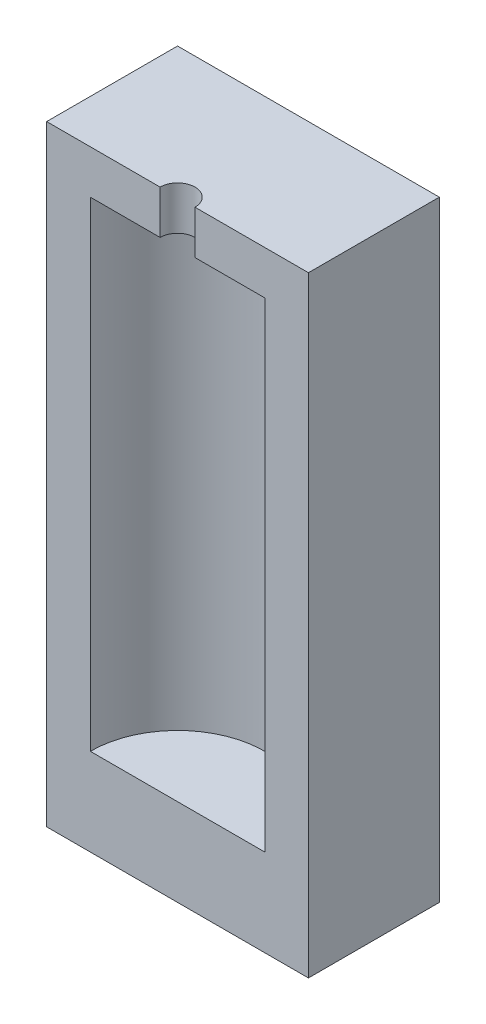
ISO-10303-21;
HEADER;
FILE_DESCRIPTION(('STEP AP214'),'2;1');
FILE_NAME('part.step','',(''),(''),'','','');
FILE_SCHEMA(('AUTOMOTIVE_DESIGN { 1 0 10303 214 1 1 1 1 }'));
ENDSEC;
DATA;
#1=APPLICATION_CONTEXT('core data for automotive mechanical design processes');
#2=APPLICATION_PROTOCOL_DEFINITION('international standard','automotive_design',2000,#1);
#3=PRODUCT_CONTEXT('',#1,'mechanical');
#4=PRODUCT('Part','Part','',(#3));
#5=PRODUCT_RELATED_PRODUCT_CATEGORY('part','',(#4));
#6=PRODUCT_DEFINITION_FORMATION('','',#4);
#7=PRODUCT_DEFINITION_CONTEXT('part definition',#1,'design');
#8=PRODUCT_DEFINITION('design','',#6,#7);
#9=PRODUCT_DEFINITION_SHAPE('','',#8);
#10=(LENGTH_UNIT() NAMED_UNIT(*) SI_UNIT(.MILLI.,.METRE.));
#11=(NAMED_UNIT(*) PLANE_ANGLE_UNIT() SI_UNIT($,.RADIAN.));
#12=(NAMED_UNIT(*) SI_UNIT($,.STERADIAN.) SOLID_ANGLE_UNIT());
#13=UNCERTAINTY_MEASURE_WITH_UNIT(LENGTH_MEASURE(1.E-05),#10,'distance_accuracy_value','');
#14=(GEOMETRIC_REPRESENTATION_CONTEXT(3) GLOBAL_UNCERTAINTY_ASSIGNED_CONTEXT((#13)) GLOBAL_UNIT_ASSIGNED_CONTEXT((#10,
#11,#12)) REPRESENTATION_CONTEXT('',''));
#15=CARTESIAN_POINT('',(0.,0.,0.));
#16=DIRECTION('',(0.,0.,1.));
#17=DIRECTION('',(1.,0.,0.));
#18=AXIS2_PLACEMENT_3D('',#15,#16,#17);
#19=CARTESIAN_POINT('',(-15.,70.,-7.5));
#20=DIRECTION('',(1.,0.,0.));
#21=DIRECTION('',(0.,0.,-1.));
#22=AXIS2_PLACEMENT_3D('',#19,#20,#21);
#23=PLANE('',#22);
#24=DIRECTION('',(0.,0.,1.));
#25=VECTOR('',#24,1.);
#26=CARTESIAN_POINT('',(-15.,0.,-7.5));
#27=LINE('',#26,#25);
#28=CARTESIAN_POINT('',(-15.,0.,-7.5));
#29=VERTEX_POINT('',#28);
#30=CARTESIAN_POINT('',(-15.,0.,7.5));
#31=VERTEX_POINT('',#30);
#32=EDGE_CURVE('E154',#29,#31,#27,.T.);
#33=ORIENTED_EDGE('',*,*,#32,.T.);
#34=DIRECTION('',(0.,-1.,0.));
#35=VECTOR('',#34,1.);
#36=CARTESIAN_POINT('',(-15.,70.,7.5));
#37=LINE('',#36,#35);
#38=CARTESIAN_POINT('',(-15.,70.,7.5));
#39=VERTEX_POINT('',#38);
#40=EDGE_CURVE('E126',#39,#31,#37,.T.);
#41=ORIENTED_EDGE('',*,*,#40,.F.);
#42=DIRECTION('',(0.,0.,1.));
#43=VECTOR('',#42,1.);
#44=CARTESIAN_POINT('',(-15.,70.,-7.5));
#45=LINE('',#44,#43);
#46=CARTESIAN_POINT('',(-15.,70.,-7.5));
#47=VERTEX_POINT('',#46);
#48=EDGE_CURVE('E155',#47,#39,#45,.T.);
#49=ORIENTED_EDGE('',*,*,#48,.F.);
#50=DIRECTION('',(0.,-1.,0.));
#51=VECTOR('',#50,1.);
#52=CARTESIAN_POINT('',(-15.,70.,-7.5));
#53=LINE('',#52,#51);
#54=EDGE_CURVE('E166',#47,#29,#53,.T.);
#55=ORIENTED_EDGE('',*,*,#54,.T.);
#56=EDGE_LOOP('',(#33,#41,#49,#55));
#57=FACE_BOUND('',#56,.T.);
#58=ADVANCED_FACE('F39',(#57),#23,.F.);
#59=CARTESIAN_POINT('',(-15.,70.,7.5));
#60=DIRECTION('',(0.,0.,-1.));
#61=DIRECTION('',(-1.,0.,0.));
#62=AXIS2_PLACEMENT_3D('',#59,#60,#61);
#63=PLANE('',#62);
#64=DIRECTION('',(0.,1.,0.));
#65=VECTOR('',#64,1.);
#66=CARTESIAN_POINT('',(-10.,10.,7.5));
#67=LINE('',#66,#65);
#68=CARTESIAN_POINT('',(-10.,10.,7.5));
#69=VERTEX_POINT('',#68);
#70=CARTESIAN_POINT('',(-10.,65.,7.5));
#71=VERTEX_POINT('',#70);
#72=EDGE_CURVE('E11',#69,#71,#67,.T.);
#73=ORIENTED_EDGE('',*,*,#72,.T.);
#74=DIRECTION('',(1.,0.,0.));
#75=VECTOR('',#74,1.);
#76=CARTESIAN_POINT('',(-15.,65.,7.5));
#77=LINE('',#76,#75);
#78=CARTESIAN_POINT('',(-2.,65.,7.5));
#79=VERTEX_POINT('',#78);
#80=EDGE_CURVE('E132',#71,#79,#77,.T.);
#81=ORIENTED_EDGE('',*,*,#80,.T.);
#82=DIRECTION('',(0.,1.,0.));
#83=VECTOR('',#82,1.);
#84=CARTESIAN_POINT('',(-2.,65.,7.5));
#85=LINE('',#84,#83);
#86=CARTESIAN_POINT('',(-2.,70.,7.5));
#87=VERTEX_POINT('',#86);
#88=EDGE_CURVE('E151',#79,#87,#85,.T.);
#89=ORIENTED_EDGE('',*,*,#88,.T.);
#90=DIRECTION('',(1.,0.,0.));
#91=VECTOR('',#90,1.);
#92=CARTESIAN_POINT('',(-15.,70.,7.5));
#93=LINE('',#92,#91);
#94=EDGE_CURVE('E92',#39,#87,#93,.T.);
#95=ORIENTED_EDGE('',*,*,#94,.F.);
#96=ORIENTED_EDGE('',*,*,#40,.T.);
#97=DIRECTION('',(1.,0.,0.));
#98=VECTOR('',#97,1.);
#99=CARTESIAN_POINT('',(-15.,0.,7.5));
#100=LINE('',#99,#98);
#101=CARTESIAN_POINT('',(15.,0.,7.5));
#102=VERTEX_POINT('',#101);
#103=EDGE_CURVE('E170',#31,#102,#100,.T.);
#104=ORIENTED_EDGE('',*,*,#103,.T.);
#105=DIRECTION('',(0.,-1.,0.));
#106=VECTOR('',#105,1.);
#107=CARTESIAN_POINT('',(15.,70.,7.5));
#108=LINE('',#107,#106);
#109=CARTESIAN_POINT('',(15.,70.,7.5));
#110=VERTEX_POINT('',#109);
#111=EDGE_CURVE('E183',#110,#102,#108,.T.);
#112=ORIENTED_EDGE('',*,*,#111,.F.);
#113=CARTESIAN_POINT('',(2.,70.,7.5));
#114=VERTEX_POINT('',#113);
#115=EDGE_CURVE('E158',#114,#110,#93,.T.);
#116=ORIENTED_EDGE('',*,*,#115,.F.);
#117=DIRECTION('',(0.,1.,0.));
#118=VECTOR('',#117,1.);
#119=CARTESIAN_POINT('',(2.,65.,7.5));
#120=LINE('',#119,#118);
#121=CARTESIAN_POINT('',(2.,65.,7.5));
#122=VERTEX_POINT('',#121);
#123=EDGE_CURVE('E54',#114,#122,#120,.F.);
#124=ORIENTED_EDGE('',*,*,#123,.T.);
#125=CARTESIAN_POINT('',(10.,65.,7.5));
#126=VERTEX_POINT('',#125);
#127=EDGE_CURVE('E130',#122,#126,#77,.T.);
#128=ORIENTED_EDGE('',*,*,#127,.T.);
#129=DIRECTION('',(0.,1.,0.));
#130=VECTOR('',#129,1.);
#131=CARTESIAN_POINT('',(10.,10.,7.5));
#132=LINE('',#131,#130);
#133=CARTESIAN_POINT('',(10.,10.,7.5));
#134=VERTEX_POINT('',#133);
#135=EDGE_CURVE('E117',#126,#134,#132,.F.);
#136=ORIENTED_EDGE('',*,*,#135,.T.);
#137=DIRECTION('',(1.,0.,0.));
#138=VECTOR('',#137,1.);
#139=CARTESIAN_POINT('',(-15.,10.,7.5));
#140=LINE('',#139,#138);
#141=EDGE_CURVE('E47',#69,#134,#140,.T.);
#142=ORIENTED_EDGE('',*,*,#141,.F.);
#143=EDGE_LOOP('',(#73,#81,#89,#95,#96,#104,#112,#116,#124,#128,#136,#142));
#144=FACE_BOUND('',#143,.T.);
#145=ADVANCED_FACE('F135',(#144),#63,.F.);
#146=CARTESIAN_POINT('',(15.,70.,-7.5));
#147=DIRECTION('',(-1.,0.,0.));
#148=DIRECTION('',(0.,0.,1.));
#149=AXIS2_PLACEMENT_3D('',#146,#147,#148);
#150=PLANE('',#149);
#151=DIRECTION('',(0.,0.,-1.));
#152=VECTOR('',#151,1.);
#153=CARTESIAN_POINT('',(15.,0.,-7.5));
#154=LINE('',#153,#152);
#155=CARTESIAN_POINT('',(15.,0.,-7.5));
#156=VERTEX_POINT('',#155);
#157=EDGE_CURVE('E173',#102,#156,#154,.T.);
#158=ORIENTED_EDGE('',*,*,#157,.T.);
#159=DIRECTION('',(0.,-1.,0.));
#160=VECTOR('',#159,1.);
#161=CARTESIAN_POINT('',(15.,70.,-7.5));
#162=LINE('',#161,#160);
#163=CARTESIAN_POINT('',(15.,70.,-7.5));
#164=VERTEX_POINT('',#163);
#165=EDGE_CURVE('E180',#164,#156,#162,.T.);
#166=ORIENTED_EDGE('',*,*,#165,.F.);
#167=DIRECTION('',(0.,0.,-1.));
#168=VECTOR('',#167,1.);
#169=CARTESIAN_POINT('',(15.,70.,-7.5));
#170=LINE('',#169,#168);
#171=EDGE_CURVE('E161',#110,#164,#170,.T.);
#172=ORIENTED_EDGE('',*,*,#171,.F.);
#173=ORIENTED_EDGE('',*,*,#111,.T.);
#174=EDGE_LOOP('',(#158,#166,#172,#173));
#175=FACE_BOUND('',#174,.T.);
#176=ADVANCED_FACE('F200',(#175),#150,.F.);
#177=CARTESIAN_POINT('',(-15.,70.,-7.5));
#178=DIRECTION('',(0.,0.,1.));
#179=DIRECTION('',(1.,0.,0.));
#180=AXIS2_PLACEMENT_3D('',#177,#178,#179);
#181=PLANE('',#180);
#182=DIRECTION('',(-1.,0.,0.));
#183=VECTOR('',#182,1.);
#184=CARTESIAN_POINT('',(-15.,0.,-7.5));
#185=LINE('',#184,#183);
#186=EDGE_CURVE('E84',#156,#29,#185,.T.);
#187=ORIENTED_EDGE('',*,*,#186,.T.);
#188=ORIENTED_EDGE('',*,*,#54,.F.);
#189=DIRECTION('',(-1.,0.,0.));
#190=VECTOR('',#189,1.);
#191=CARTESIAN_POINT('',(-15.,70.,-7.5));
#192=LINE('',#191,#190);
#193=EDGE_CURVE('E63',#164,#47,#192,.T.);
#194=ORIENTED_EDGE('',*,*,#193,.F.);
#195=ORIENTED_EDGE('',*,*,#165,.T.);
#196=EDGE_LOOP('',(#187,#188,#194,#195));
#197=FACE_BOUND('',#196,.T.);
#198=ADVANCED_FACE('F201',(#197),#181,.F.);
#199=CARTESIAN_POINT('',(0.,70.,0.));
#200=DIRECTION('',(0.,1.,0.));
#201=DIRECTION('',(0.,0.,1.));
#202=AXIS2_PLACEMENT_3D('',#199,#200,#201);
#203=PLANE('',#202);
#204=CARTESIAN_POINT('',(0.,70.,7.5));
#205=DIRECTION('',(0.,1.,0.));
#206=DIRECTION('',(0.,0.,1.));
#207=AXIS2_PLACEMENT_3D('',#204,#205,#206);
#208=CIRCLE('',#207,2.);
#209=EDGE_CURVE('E141',#114,#87,#208,.T.);
#210=ORIENTED_EDGE('',*,*,#209,.F.);
#211=ORIENTED_EDGE('',*,*,#115,.T.);
#212=ORIENTED_EDGE('',*,*,#171,.T.);
#213=ORIENTED_EDGE('',*,*,#193,.T.);
#214=ORIENTED_EDGE('',*,*,#48,.T.);
#215=ORIENTED_EDGE('',*,*,#94,.T.);
#216=EDGE_LOOP('',(#210,#211,#212,#213,#214,#215));
#217=FACE_BOUND('',#216,.T.);
#218=ADVANCED_FACE('F193',(#217),#203,.T.);
#219=CARTESIAN_POINT('',(0.,0.,0.));
#220=DIRECTION('',(0.,1.,0.));
#221=DIRECTION('',(0.,0.,1.));
#222=AXIS2_PLACEMENT_3D('',#219,#220,#221);
#223=PLANE('',#222);
#224=ORIENTED_EDGE('',*,*,#32,.F.);
#225=ORIENTED_EDGE('',*,*,#186,.F.);
#226=ORIENTED_EDGE('',*,*,#157,.F.);
#227=ORIENTED_EDGE('',*,*,#103,.F.);
#228=EDGE_LOOP('',(#224,#225,#226,#227));
#229=FACE_BOUND('',#228,.T.);
#230=ADVANCED_FACE('F207',(#229),#223,.F.);
#231=CARTESIAN_POINT('',(0.,65.,7.5));
#232=DIRECTION('',(0.,1.,0.));
#233=DIRECTION('',(0.,0.,1.));
#234=AXIS2_PLACEMENT_3D('',#231,#232,#233);
#235=CYLINDRICAL_SURFACE('',#234,2.);
#236=CARTESIAN_POINT('',(0.,65.,7.5));
#237=DIRECTION('',(0.,1.,0.));
#238=DIRECTION('',(0.,0.,1.));
#239=AXIS2_PLACEMENT_3D('',#236,#237,#238);
#240=CIRCLE('',#239,2.);
#241=EDGE_CURVE('E144',#122,#79,#240,.T.);
#242=ORIENTED_EDGE('',*,*,#241,.F.);
#243=ORIENTED_EDGE('',*,*,#123,.F.);
#244=ORIENTED_EDGE('',*,*,#209,.T.);
#245=ORIENTED_EDGE('',*,*,#88,.F.);
#246=EDGE_LOOP('',(#242,#243,#244,#245));
#247=FACE_BOUND('',#246,.T.);
#248=ADVANCED_FACE('F192',(#247),#235,.F.);
#249=CARTESIAN_POINT('',(0.,10.,7.5));
#250=DIRECTION('',(0.,1.,0.));
#251=DIRECTION('',(0.,0.,1.));
#252=AXIS2_PLACEMENT_3D('',#249,#250,#251);
#253=CYLINDRICAL_SURFACE('',#252,10.);
#254=CARTESIAN_POINT('',(0.,10.,7.5));
#255=DIRECTION('',(0.,1.,0.));
#256=DIRECTION('',(0.,0.,1.));
#257=AXIS2_PLACEMENT_3D('',#254,#255,#256);
#258=CIRCLE('',#257,10.);
#259=EDGE_CURVE('E122',#134,#69,#258,.T.);
#260=ORIENTED_EDGE('',*,*,#259,.F.);
#261=ORIENTED_EDGE('',*,*,#135,.F.);
#262=CARTESIAN_POINT('',(0.,65.,7.5));
#263=DIRECTION('',(0.,1.,0.));
#264=DIRECTION('',(0.,0.,1.));
#265=AXIS2_PLACEMENT_3D('',#262,#263,#264);
#266=CIRCLE('',#265,10.);
#267=EDGE_CURVE('E120',#126,#71,#266,.T.);
#268=ORIENTED_EDGE('',*,*,#267,.T.);
#269=ORIENTED_EDGE('',*,*,#72,.F.);
#270=EDGE_LOOP('',(#260,#261,#268,#269));
#271=FACE_BOUND('',#270,.T.);
#272=ADVANCED_FACE('F119',(#271),#253,.F.);
#273=CARTESIAN_POINT('',(0.,10.,7.5));
#274=DIRECTION('',(0.,1.,0.));
#275=DIRECTION('',(0.,0.,1.));
#276=AXIS2_PLACEMENT_3D('',#273,#274,#275);
#277=PLANE('',#276);
#278=ORIENTED_EDGE('',*,*,#141,.T.);
#279=ORIENTED_EDGE('',*,*,#259,.T.);
#280=EDGE_LOOP('',(#278,#279));
#281=FACE_BOUND('',#280,.T.);
#282=ADVANCED_FACE('F190',(#281),#277,.T.);
#283=CARTESIAN_POINT('',(0.,65.,7.5));
#284=DIRECTION('',(0.,1.,0.));
#285=DIRECTION('',(0.,0.,1.));
#286=AXIS2_PLACEMENT_3D('',#283,#284,#285);
#287=PLANE('',#286);
#288=ORIENTED_EDGE('',*,*,#267,.F.);
#289=ORIENTED_EDGE('',*,*,#127,.F.);
#290=ORIENTED_EDGE('',*,*,#241,.T.);
#291=ORIENTED_EDGE('',*,*,#80,.F.);
#292=EDGE_LOOP('',(#288,#289,#290,#291));
#293=FACE_BOUND('',#292,.T.);
#294=ADVANCED_FACE('F129',(#293),#287,.F.);
#295=CLOSED_SHELL('',(#58,#145,#176,#198,#218,#230,#248,#272,#282,#294));
#296=MANIFOLD_SOLID_BREP('B2',#295);
#297=ADVANCED_BREP_SHAPE_REPRESENTATION('',(#18,#296),#14);
#298=SHAPE_DEFINITION_REPRESENTATION(#9,#297);
ENDSEC;
END-ISO-10303-21;
